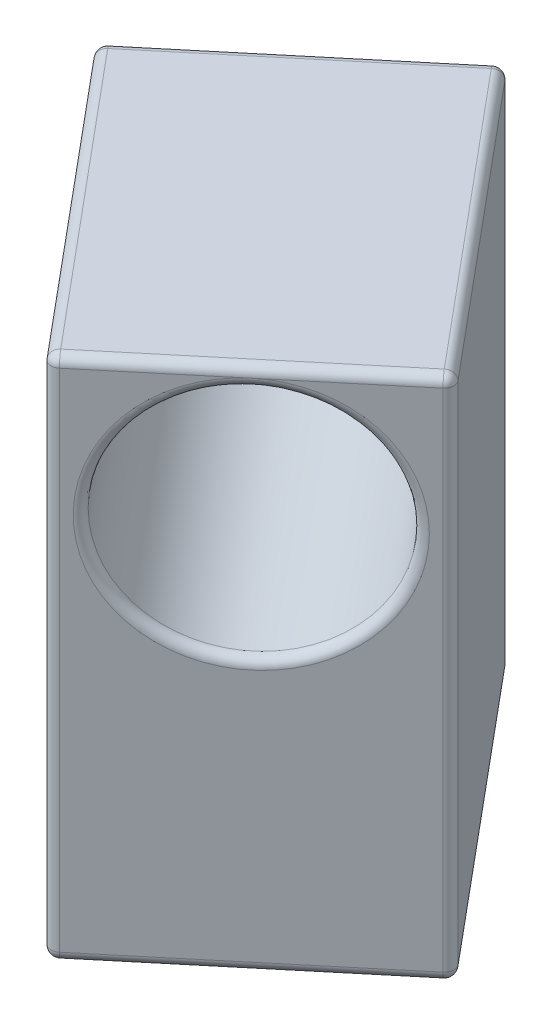
ISO-10303-21;
HEADER;
FILE_DESCRIPTION(('STEP AP214'),'2;1');
FILE_NAME('part.step','',(''),(''),'','','');
FILE_SCHEMA(('AUTOMOTIVE_DESIGN { 1 0 10303 214 1 1 1 1 }'));
ENDSEC;
DATA;
#1=APPLICATION_CONTEXT('core data for automotive mechanical design processes');
#2=APPLICATION_PROTOCOL_DEFINITION('international standard','automotive_design',2000,#1);
#3=PRODUCT_CONTEXT('',#1,'mechanical');
#4=PRODUCT('Part','Part','',(#3));
#5=PRODUCT_RELATED_PRODUCT_CATEGORY('part','',(#4));
#6=PRODUCT_DEFINITION_FORMATION('','',#4);
#7=PRODUCT_DEFINITION_CONTEXT('part definition',#1,'design');
#8=PRODUCT_DEFINITION('design','',#6,#7);
#9=PRODUCT_DEFINITION_SHAPE('','',#8);
#10=(LENGTH_UNIT() NAMED_UNIT(*) SI_UNIT(.MILLI.,.METRE.));
#11=(NAMED_UNIT(*) PLANE_ANGLE_UNIT() SI_UNIT($,.RADIAN.));
#12=(NAMED_UNIT(*) SI_UNIT($,.STERADIAN.) SOLID_ANGLE_UNIT());
#13=UNCERTAINTY_MEASURE_WITH_UNIT(LENGTH_MEASURE(1.E-05),#10,'distance_accuracy_value','');
#14=(GEOMETRIC_REPRESENTATION_CONTEXT(3) GLOBAL_UNCERTAINTY_ASSIGNED_CONTEXT((#13)) GLOBAL_UNIT_ASSIGNED_CONTEXT((#10,
#11,#12)) REPRESENTATION_CONTEXT('',''));
#15=CARTESIAN_POINT('',(0.,0.,0.));
#16=DIRECTION('',(0.,0.,1.));
#17=DIRECTION('',(1.,0.,0.));
#18=AXIS2_PLACEMENT_3D('',#15,#16,#17);
#19=CARTESIAN_POINT('',(199.483711764187,-20.,-235.862123975211));
#20=DIRECTION('',(0.767782639292157,0.,-0.640710401664878));
#21=DIRECTION('',(-0.640710401664878,0.,-0.767782639292157));
#22=AXIS2_PLACEMENT_3D('',#19,#20,#21);
#23=PLANE('',#22);
#24=DIRECTION('',(0.,1.,0.));
#25=VECTOR('',#24,1.);
#26=CARTESIAN_POINT('',(211.977564596652,-20.,-220.890362509014));
#27=LINE('',#26,#25);
#28=CARTESIAN_POINT('',(211.977564596652,6.5,-220.890362509014));
#29=VERTEX_POINT('',#28);
#30=CARTESIAN_POINT('',(211.977564596652,-19.5,-220.890362509014));
#31=VERTEX_POINT('',#30);
#32=EDGE_CURVE('E242',#29,#31,#27,.F.);
#33=ORIENTED_EDGE('',*,*,#32,.T.);
#34=DIRECTION('',(-0.640710401664878,0.,-0.767782639292157));
#35=VECTOR('',#34,1.);
#36=CARTESIAN_POINT('',(199.483711764187,-19.5,-235.862123975211));
#37=LINE('',#36,#35);
#38=CARTESIAN_POINT('',(199.80406696502,-19.5,-235.478232655565));
#39=VERTEX_POINT('',#38);
#40=EDGE_CURVE('E248',#31,#39,#37,.T.);
#41=ORIENTED_EDGE('',*,*,#40,.T.);
#42=DIRECTION('',(0.,1.,0.));
#43=VECTOR('',#42,1.);
#44=CARTESIAN_POINT('',(199.80406696502,-20.,-235.478232655565));
#45=LINE('',#44,#43);
#46=CARTESIAN_POINT('',(199.80406696502,6.5,-235.478232655565));
#47=VERTEX_POINT('',#46);
#48=EDGE_CURVE('E245',#39,#47,#45,.T.);
#49=ORIENTED_EDGE('',*,*,#48,.T.);
#50=DIRECTION('',(-0.640710401664878,0.,-0.767782639292157));
#51=VECTOR('',#50,1.);
#52=CARTESIAN_POINT('',(199.483711764187,6.5,-235.862123975211));
#53=LINE('',#52,#51);
#54=EDGE_CURVE('E239',#47,#29,#53,.F.);
#55=ORIENTED_EDGE('',*,*,#54,.T.);
#56=EDGE_LOOP('',(#33,#41,#49,#55));
#57=FACE_BOUND('',#56,.T.);
#58=ADVANCED_FACE('F48',(#57),#23,.T.);
#59=CARTESIAN_POINT('',(200.781180208103,-20.,-210.895815164395));
#60=DIRECTION('',(0.640710401664878,0.,0.767782639292157));
#61=DIRECTION('',(0.767782639292157,0.,-0.640710401664878));
#62=AXIS2_PLACEMENT_3D('',#59,#60,#61);
#63=PLANE('',#62);
#64=CARTESIAN_POINT('',(206.539550002794,0.,-215.701143176882));
#65=DIRECTION('',(0.640710401664878,0.,0.767782639292157));
#66=DIRECTION('',(0.767782639292157,0.,-0.640710401664878));
#67=AXIS2_PLACEMENT_3D('',#64,#65,#66);
#68=CIRCLE('',#67,6.49999999999998);
#69=CARTESIAN_POINT('',(206.539550002794,6.5,-215.701143176882));
#70=VERTEX_POINT('',#69);
#71=CARTESIAN_POINT('',(211.530137158193,0.,-219.865760787703));
#72=VERTEX_POINT('',#71);
#73=EDGE_CURVE('E267',#70,#72,#68,.F.);
#74=ORIENTED_EDGE('',*,*,#73,.T.);
#75=CARTESIAN_POINT('',(206.539550002794,0.,-215.701143176882));
#76=DIRECTION('',(0.640710401664878,0.,0.767782639292157));
#77=DIRECTION('',(0.767782639292157,0.,-0.640710401664878));
#78=AXIS2_PLACEMENT_3D('',#75,#76,#77);
#79=CIRCLE('',#78,6.49999999999998);
#80=EDGE_CURVE('E270',#72,#70,#79,.F.);
#81=ORIENTED_EDGE('',*,*,#80,.T.);
#82=DIRECTION('',(0.767782639292157,0.,-0.640710401664878));
#83=VECTOR('',#82,1.);
#84=CARTESIAN_POINT('',(200.781180208103,6.5,-210.895815164395));
#85=LINE('',#84,#83);
#86=CARTESIAN_POINT('',(201.165071527749,6.5,-211.216170365227));
#87=VERTEX_POINT('',#86);
#88=EDGE_CURVE('E252',#70,#87,#85,.F.);
#89=ORIENTED_EDGE('',*,*,#88,.T.);
#90=DIRECTION('',(0.,1.,0.));
#91=VECTOR('',#90,1.);
#92=CARTESIAN_POINT('',(201.165071527749,-20.,-211.216170365227));
#93=LINE('',#92,#91);
#94=CARTESIAN_POINT('',(201.165071527749,-19.5,-211.216170365227));
#95=VERTEX_POINT('',#94);
#96=EDGE_CURVE('E259',#87,#95,#93,.F.);
#97=ORIENTED_EDGE('',*,*,#96,.T.);
#98=DIRECTION('',(0.767782639292157,0.,-0.640710401664878));
#99=VECTOR('',#98,1.);
#100=CARTESIAN_POINT('',(212.297919797485,-19.5,-220.506471189368));
#101=LINE('',#100,#99);
#102=CARTESIAN_POINT('',(211.914028477839,-19.5,-220.186115988536));
#103=VERTEX_POINT('',#102);
#104=EDGE_CURVE('E168',#95,#103,#101,.T.);
#105=ORIENTED_EDGE('',*,*,#104,.T.);
#106=DIRECTION('',(0.,1.,0.));
#107=VECTOR('',#106,1.);
#108=CARTESIAN_POINT('',(211.914028477839,-20.,-220.186115988536));
#109=LINE('',#108,#107);
#110=CARTESIAN_POINT('',(211.914028477839,6.5,-220.186115988536));
#111=VERTEX_POINT('',#110);
#112=EDGE_CURVE('E262',#103,#111,#109,.T.);
#113=ORIENTED_EDGE('',*,*,#112,.T.);
#114=DIRECTION('',(0.767782639292157,0.,-0.640710401664878));
#115=VECTOR('',#114,1.);
#116=CARTESIAN_POINT('',(200.781180208103,6.5,-210.895815164395));
#117=LINE('',#116,#115);
#118=EDGE_CURVE('E255',#111,#70,#117,.F.);
#119=ORIENTED_EDGE('',*,*,#118,.T.);
#120=EDGE_LOOP('',(#74,#81,#89,#97,#105,#113,#119));
#121=FACE_BOUND('',#120,.T.);
#122=ADVANCED_FACE('F393',(#121),#63,.T.);
#123=CARTESIAN_POINT('',(187.966972174805,-20.,-226.251467950238));
#124=DIRECTION('',(-0.767782639292157,0.,0.640710401664878));
#125=DIRECTION('',(0.640710401664878,0.,0.767782639292157));
#126=AXIS2_PLACEMENT_3D('',#123,#124,#125);
#127=PLANE('',#126);
#128=DIRECTION('',(0.,1.,0.));
#129=VECTOR('',#128,1.);
#130=CARTESIAN_POINT('',(188.287327375637,-20.,-225.867576630592));
#131=LINE('',#130,#129);
#132=CARTESIAN_POINT('',(188.287327375637,6.5,-225.867576630592));
#133=VERTEX_POINT('',#132);
#134=CARTESIAN_POINT('',(188.287327375637,-19.5,-225.867576630592));
#135=VERTEX_POINT('',#134);
#136=EDGE_CURVE('E280',#133,#135,#131,.F.);
#137=ORIENTED_EDGE('',*,*,#136,.T.);
#138=DIRECTION('',(0.640710401664878,0.,0.767782639292157));
#139=VECTOR('',#138,1.);
#140=CARTESIAN_POINT('',(200.781180208103,-19.5,-210.895815164395));
#141=LINE('',#140,#139);
#142=CARTESIAN_POINT('',(200.46082500727,-19.5,-211.279706484041));
#143=VERTEX_POINT('',#142);
#144=EDGE_CURVE('E283',#135,#143,#141,.T.);
#145=ORIENTED_EDGE('',*,*,#144,.T.);
#146=DIRECTION('',(0.,1.,0.));
#147=VECTOR('',#146,1.);
#148=CARTESIAN_POINT('',(200.46082500727,-20.,-211.279706484041));
#149=LINE('',#148,#147);
#150=CARTESIAN_POINT('',(200.46082500727,6.5,-211.279706484041));
#151=VERTEX_POINT('',#150);
#152=EDGE_CURVE('E277',#143,#151,#149,.T.);
#153=ORIENTED_EDGE('',*,*,#152,.T.);
#154=DIRECTION('',(0.640710401664878,0.,0.767782639292157));
#155=VECTOR('',#154,1.);
#156=CARTESIAN_POINT('',(187.966972174805,6.5,-226.251467950238));
#157=LINE('',#156,#155);
#158=EDGE_CURVE('E274',#151,#133,#157,.F.);
#159=ORIENTED_EDGE('',*,*,#158,.T.);
#160=EDGE_LOOP('',(#137,#145,#153,#159));
#161=FACE_BOUND('',#160,.T.);
#162=ADVANCED_FACE('F399',(#161),#127,.T.);
#163=CARTESIAN_POINT('',(187.966972174805,-20.,-226.251467950238));
#164=DIRECTION('',(-0.640710401664878,0.,-0.767782639292157));
#165=DIRECTION('',(-0.767782639292157,0.,0.640710401664878));
#166=AXIS2_PLACEMENT_3D('',#163,#164,#165);
#167=PLANE('',#166);
#168=CARTESIAN_POINT('',(193.725341969496,0.,-231.056795962725));
#169=DIRECTION('',(-0.640710401664878,0.,-0.767782639292157));
#170=DIRECTION('',(-0.767782639292157,0.,0.640710401664878));
#171=AXIS2_PLACEMENT_3D('',#168,#169,#170);
#172=CIRCLE('',#171,6.49999999999998);
#173=CARTESIAN_POINT('',(193.725341969496,6.5,-231.056795962725));
#174=VERTEX_POINT('',#173);
#175=CARTESIAN_POINT('',(188.734754814097,0.,-226.892178351903));
#176=VERTEX_POINT('',#175);
#177=EDGE_CURVE('E224',#174,#176,#172,.F.);
#178=ORIENTED_EDGE('',*,*,#177,.T.);
#179=CARTESIAN_POINT('',(193.725341969496,0.,-231.056795962725));
#180=DIRECTION('',(-0.640710401664878,0.,-0.767782639292157));
#181=DIRECTION('',(-0.767782639292157,0.,0.640710401664878));
#182=AXIS2_PLACEMENT_3D('',#179,#180,#181);
#183=CIRCLE('',#182,6.49999999999998);
#184=EDGE_CURVE('E227',#176,#174,#183,.F.);
#185=ORIENTED_EDGE('',*,*,#184,.T.);
#186=DIRECTION('',(-0.767782639292157,0.,0.640710401664878));
#187=VECTOR('',#186,1.);
#188=CARTESIAN_POINT('',(187.966972174805,6.5,-226.251467950238));
#189=LINE('',#188,#187);
#190=CARTESIAN_POINT('',(199.099820444541,6.5,-235.541768774379));
#191=VERTEX_POINT('',#190);
#192=EDGE_CURVE('E207',#174,#191,#189,.F.);
#193=ORIENTED_EDGE('',*,*,#192,.T.);
#194=DIRECTION('',(0.,1.,0.));
#195=VECTOR('',#194,1.);
#196=CARTESIAN_POINT('',(199.099820444541,-20.,-235.541768774379));
#197=LINE('',#196,#195);
#198=CARTESIAN_POINT('',(199.099820444541,-19.5,-235.541768774379));
#199=VERTEX_POINT('',#198);
#200=EDGE_CURVE('E217',#191,#199,#197,.F.);
#201=ORIENTED_EDGE('',*,*,#200,.T.);
#202=DIRECTION('',(-0.767782639292157,0.,0.640710401664878));
#203=VECTOR('',#202,1.);
#204=CARTESIAN_POINT('',(187.966972174805,-19.5,-226.251467950238));
#205=LINE('',#204,#203);
#206=CARTESIAN_POINT('',(188.350863494451,-19.5,-226.571823151071));
#207=VERTEX_POINT('',#206);
#208=EDGE_CURVE('E220',#199,#207,#205,.T.);
#209=ORIENTED_EDGE('',*,*,#208,.T.);
#210=DIRECTION('',(0.,1.,0.));
#211=VECTOR('',#210,1.);
#212=CARTESIAN_POINT('',(188.350863494451,-20.,-226.571823151071));
#213=LINE('',#212,#211);
#214=CARTESIAN_POINT('',(188.350863494451,6.5,-226.571823151071));
#215=VERTEX_POINT('',#214);
#216=EDGE_CURVE('E214',#207,#215,#213,.T.);
#217=ORIENTED_EDGE('',*,*,#216,.T.);
#218=DIRECTION('',(-0.767782639292157,0.,0.640710401664878));
#219=VECTOR('',#218,1.);
#220=CARTESIAN_POINT('',(187.966972174805,6.5,-226.251467950238));
#221=LINE('',#220,#219);
#222=EDGE_CURVE('E210',#215,#174,#221,.F.);
#223=ORIENTED_EDGE('',*,*,#222,.T.);
#224=EDGE_LOOP('',(#178,#185,#193,#201,#209,#217,#223));
#225=FACE_BOUND('',#224,.T.);
#226=ADVANCED_FACE('F404',(#225),#167,.T.);
#227=CARTESIAN_POINT('',(0.,-20.,0.));
#228=DIRECTION('',(0.,1.,0.));
#229=DIRECTION('',(0.,0.,1.));
#230=AXIS2_PLACEMENT_3D('',#227,#228,#229);
#231=PLANE('',#230);
#232=CARTESIAN_POINT('',(200.132445986145,-20.,-223.378969569803));
#233=DIRECTION('',(0.,1.,0.));
#234=DIRECTION('',(0.,0.,1.));
#235=AXIS2_PLACEMENT_3D('',#232,#233,#234);
#236=CIRCLE('',#235,6.50000000000002);
#237=CARTESIAN_POINT('',(200.132445986145,-20.,-216.878969569803));
#238=VERTEX_POINT('',#237);
#239=EDGE_CURVE('E203',#238,#238,#236,.T.);
#240=ORIENTED_EDGE('',*,*,#239,.T.);
#241=EDGE_LOOP('',(#240));
#242=FACE_BOUND('',#241,.T.);
#243=DIRECTION('',(0.640710401664878,0.,0.767782639292157));
#244=VECTOR('',#243,1.);
#245=CARTESIAN_POINT('',(188.350863494451,-20.,-226.571823151071));
#246=LINE('',#245,#244);
#247=CARTESIAN_POINT('',(200.844716326916,-20.,-211.600061684873));
#248=VERTEX_POINT('',#247);
#249=CARTESIAN_POINT('',(188.671218695283,-20.,-226.187931831424));
#250=VERTEX_POINT('',#249);
#251=EDGE_CURVE('E153',#248,#250,#246,.F.);
#252=ORIENTED_EDGE('',*,*,#251,.T.);
#253=DIRECTION('',(-0.767782639292157,0.,0.640710401664878));
#254=VECTOR('',#253,1.);
#255=CARTESIAN_POINT('',(199.80406696502,-20.,-235.478232655565));
#256=LINE('',#255,#254);
#257=CARTESIAN_POINT('',(199.420175645374,-20.,-235.157877454733));
#258=VERTEX_POINT('',#257);
#259=EDGE_CURVE('E200',#250,#258,#256,.F.);
#260=ORIENTED_EDGE('',*,*,#259,.T.);
#261=DIRECTION('',(-0.640710401664878,0.,-0.767782639292157));
#262=VECTOR('',#261,1.);
#263=CARTESIAN_POINT('',(211.914028477839,-20.,-220.186115988536));
#264=LINE('',#263,#262);
#265=CARTESIAN_POINT('',(211.593673277006,-20.,-220.570007308182));
#266=VERTEX_POINT('',#265);
#267=EDGE_CURVE('E156',#258,#266,#264,.F.);
#268=ORIENTED_EDGE('',*,*,#267,.T.);
#269=DIRECTION('',(0.767782639292157,0.,-0.640710401664878));
#270=VECTOR('',#269,1.);
#271=CARTESIAN_POINT('',(200.46082500727,-20.,-211.279706484041));
#272=LINE('',#271,#270);
#273=EDGE_CURVE('E148',#266,#248,#272,.F.);
#274=ORIENTED_EDGE('',*,*,#273,.T.);
#275=EDGE_LOOP('',(#252,#260,#268,#274));
#276=FACE_BOUND('',#275,.T.);
#277=ADVANCED_FACE('F150',(#242,#276),#231,.F.);
#278=CARTESIAN_POINT('',(0.,7.,0.));
#279=DIRECTION('',(0.,1.,0.));
#280=DIRECTION('',(0.,0.,1.));
#281=AXIS2_PLACEMENT_3D('',#278,#279,#280);
#282=PLANE('',#281);
#283=DIRECTION('',(0.640710401664878,0.,0.767782639292157));
#284=VECTOR('',#283,1.);
#285=CARTESIAN_POINT('',(222.487628556415,7.,-185.664705819955));
#286=LINE('',#285,#284);
#287=CARTESIAN_POINT('',(188.671218695283,7.,-226.187931831424));
#288=VERTEX_POINT('',#287);
#289=CARTESIAN_POINT('',(200.844716326916,7.,-211.600061684873));
#290=VERTEX_POINT('',#289);
#291=EDGE_CURVE('E58',#288,#290,#286,.T.);
#292=ORIENTED_EDGE('',*,*,#291,.T.);
#293=DIRECTION('',(0.767782639292157,0.,-0.640710401664878));
#294=VECTOR('',#293,1.);
#295=CARTESIAN_POINT('',(-21.6429122294992,7.,-25.9353558649184));
#296=LINE('',#295,#294);
#297=CARTESIAN_POINT('',(211.593673277006,7.,-220.570007308182));
#298=VERTEX_POINT('',#297);
#299=EDGE_CURVE('E12',#290,#298,#296,.T.);
#300=ORIENTED_EDGE('',*,*,#299,.T.);
#301=DIRECTION('',(-0.640710401664878,0.,-0.767782639292157));
#302=VECTOR('',#301,1.);
#303=CARTESIAN_POINT('',(233.236585506506,7.,-194.634651443263));
#304=LINE('',#303,#302);
#305=CARTESIAN_POINT('',(199.420175645374,7.,-235.157877454733));
#306=VERTEX_POINT('',#305);
#307=EDGE_CURVE('E287',#298,#306,#304,.T.);
#308=ORIENTED_EDGE('',*,*,#307,.T.);
#309=DIRECTION('',(-0.767782639292157,0.,0.640710401664878));
#310=VECTOR('',#309,1.);
#311=CARTESIAN_POINT('',(-33.8164098611319,7.,-40.5232260114694));
#312=LINE('',#311,#310);
#313=EDGE_CURVE('E69',#306,#288,#312,.T.);
#314=ORIENTED_EDGE('',*,*,#313,.T.);
#315=EDGE_LOOP('',(#292,#300,#308,#314));
#316=FACE_BOUND('',#315,.T.);
#317=ADVANCED_FACE('F382',(#316),#282,.T.);
#318=CARTESIAN_POINT('',(200.132445986145,-10.,-223.378969569803));
#319=DIRECTION('',(0.,-1.,0.));
#320=DIRECTION('',(0.,0.,-1.));
#321=AXIS2_PLACEMENT_3D('',#318,#319,#320);
#322=CYLINDRICAL_SURFACE('',#321,6.00000000000002);
#323=CARTESIAN_POINT('',(200.132445986145,-19.5,-223.378969569803));
#324=DIRECTION('',(0.,1.,0.));
#325=DIRECTION('',(0.,0.,1.));
#326=AXIS2_PLACEMENT_3D('',#323,#324,#325);
#327=CIRCLE('',#326,6.00000000000002);
#328=CARTESIAN_POINT('',(200.132445986145,-19.5,-217.378969569803));
#329=VERTEX_POINT('',#328);
#330=EDGE_CURVE('E190',#329,#329,#327,.F.);
#331=ORIENTED_EDGE('',*,*,#330,.T.);
#332=EDGE_LOOP('',(#331));
#333=FACE_BOUND('',#332,.T.);
#334=CARTESIAN_POINT('',(200.132445986145,-10.,-223.378969569803));
#335=DIRECTION('',(0.,-1.,0.));
#336=DIRECTION('',(0.,0.,-1.));
#337=AXIS2_PLACEMENT_3D('',#334,#335,#336);
#338=CIRCLE('',#337,6.00000000000002);
#339=CARTESIAN_POINT('',(200.132445986145,-10.,-229.378969569803));
#340=VERTEX_POINT('',#339);
#341=EDGE_CURVE('E194',#340,#340,#338,.T.);
#342=ORIENTED_EDGE('',*,*,#341,.F.);
#343=EDGE_LOOP('',(#342));
#344=FACE_BOUND('',#343,.T.);
#345=ADVANCED_FACE('F380',(#333,#344),#322,.F.);
#346=CARTESIAN_POINT('',(200.132445986145,-10.,-223.378969569803));
#347=DIRECTION('',(0.,-1.,0.));
#348=DIRECTION('',(0.,0.,-1.));
#349=AXIS2_PLACEMENT_3D('',#346,#347,#348);
#350=PLANE('',#349);
#351=ORIENTED_EDGE('',*,*,#341,.T.);
#352=EDGE_LOOP('',(#351));
#353=FACE_BOUND('',#352,.T.);
#354=ADVANCED_FACE('F378',(#353),#350,.T.);
#355=CARTESIAN_POINT('',(128.459886797962,0.,-309.266363492759));
#356=DIRECTION('',(0.640710401664878,0.,0.767782639292157));
#357=DIRECTION('',(0.767782639292157,0.,-0.640710401664878));
#358=AXIS2_PLACEMENT_3D('',#355,#356,#357);
#359=CYLINDRICAL_SURFACE('',#358,5.99999999999998);
#360=CARTESIAN_POINT('',(194.045697170329,0.,-230.672904643079));
#361=DIRECTION('',(-0.640710401664878,0.,-0.767782639292157));
#362=DIRECTION('',(-0.767782639292157,0.,0.640710401664878));
#363=AXIS2_PLACEMENT_3D('',#360,#361,#362);
#364=CIRCLE('',#363,5.99999999999998);
#365=CARTESIAN_POINT('',(189.439001334576,0.,-226.828642233089));
#366=VERTEX_POINT('',#365);
#367=EDGE_CURVE('E235',#366,#366,#364,.T.);
#368=ORIENTED_EDGE('',*,*,#367,.T.);
#369=EDGE_LOOP('',(#368));
#370=FACE_BOUND('',#369,.T.);
#371=CARTESIAN_POINT('',(206.219194801961,0.,-216.085034496528));
#372=DIRECTION('',(0.640710401664878,0.,0.767782639292157));
#373=DIRECTION('',(0.767782639292157,0.,-0.640710401664878));
#374=AXIS2_PLACEMENT_3D('',#371,#372,#373);
#375=CIRCLE('',#374,5.99999999999998);
#376=CARTESIAN_POINT('',(210.825890637714,0.,-219.929296906517));
#377=VERTEX_POINT('',#376);
#378=EDGE_CURVE('E231',#377,#377,#375,.T.);
#379=ORIENTED_EDGE('',*,*,#378,.T.);
#380=EDGE_LOOP('',(#379));
#381=FACE_BOUND('',#380,.T.);
#382=ADVANCED_FACE('F389',(#370,#381),#359,.F.);
#383=CARTESIAN_POINT('',(200.132445986145,-19.5,-223.378969569803));
#384=DIRECTION('',(0.,1.,0.));
#385=DIRECTION('',(0.,0.,1.));
#386=AXIS2_PLACEMENT_3D('',#383,#384,#385);
#387=TOROIDAL_SURFACE('',#386,6.50000000000002,0.5);
#388=ORIENTED_EDGE('',*,*,#239,.F.);
#389=EDGE_LOOP('',(#388));
#390=FACE_BOUND('',#389,.T.);
#391=ORIENTED_EDGE('',*,*,#330,.F.);
#392=EDGE_LOOP('',(#391));
#393=FACE_BOUND('',#392,.T.);
#394=ADVANCED_FACE('F406',(#390,#393),#387,.T.);
#395=CARTESIAN_POINT('',(-21.6429122294992,6.5,-25.9353558649184));
#396=DIRECTION('',(0.767782639292157,0.,-0.640710401664878));
#397=DIRECTION('',(-0.640710401664878,0.,-0.767782639292157));
#398=AXIS2_PLACEMENT_3D('',#395,#396,#397);
#399=CYLINDRICAL_SURFACE('',#398,0.5);
#400=CARTESIAN_POINT('',(211.593673277006,6.5,-220.570007308182));
#401=DIRECTION('',(0.767782639292145,0.,-0.640710401664892));
#402=DIRECTION('',(-0.640710401664892,0.,-0.767782639292146));
#403=AXIS2_PLACEMENT_3D('',#400,#401,#402);
#404=CIRCLE('',#403,0.5);
#405=EDGE_CURVE('E52',#298,#111,#404,.T.);
#406=ORIENTED_EDGE('',*,*,#405,.F.);
#407=ORIENTED_EDGE('',*,*,#299,.F.);
#408=CARTESIAN_POINT('',(200.844716326916,6.5,-211.600061684873));
#409=DIRECTION('',(-0.767782639292172,0.,0.640710401664859));
#410=DIRECTION('',(0.640710401664859,0.,0.767782639292173));
#411=AXIS2_PLACEMENT_3D('',#408,#409,#410);
#412=CIRCLE('',#411,0.5);
#413=EDGE_CURVE('E361',#87,#290,#412,.T.);
#414=ORIENTED_EDGE('',*,*,#413,.F.);
#415=ORIENTED_EDGE('',*,*,#88,.F.);
#416=ORIENTED_EDGE('',*,*,#118,.F.);
#417=EDGE_LOOP('',(#406,#407,#414,#415,#416));
#418=FACE_BOUND('',#417,.T.);
#419=ADVANCED_FACE('F409',(#418),#399,.T.);
#420=CARTESIAN_POINT('',(211.593673277006,6.5,-220.570007308182));
#421=DIRECTION('',(0.640710401664887,0.,0.76778263929215));
#422=DIRECTION('',(0.76778263929215,0.,-0.640710401664887));
#423=AXIS2_PLACEMENT_3D('',#420,#421,#422);
#424=SPHERICAL_SURFACE('',#423,0.5);
#425=CARTESIAN_POINT('',(211.593673277006,6.5,-220.570007308182));
#426=DIRECTION('',(0.640710401664859,0.,0.767782639292172));
#427=DIRECTION('',(0.767782639292173,0.,-0.640710401664859));
#428=AXIS2_PLACEMENT_3D('',#425,#426,#427);
#429=CIRCLE('',#428,0.5);
#430=EDGE_CURVE('E354',#298,#29,#429,.F.);
#431=ORIENTED_EDGE('',*,*,#430,.F.);
#432=ORIENTED_EDGE('',*,*,#405,.T.);
#433=CARTESIAN_POINT('',(211.593673277006,6.5,-220.570007308182));
#434=DIRECTION('',(0.,1.,0.));
#435=DIRECTION('',(0.,0.,1.));
#436=AXIS2_PLACEMENT_3D('',#433,#434,#435);
#437=CIRCLE('',#436,0.5);
#438=EDGE_CURVE('E358',#29,#111,#437,.F.);
#439=ORIENTED_EDGE('',*,*,#438,.F.);
#440=EDGE_LOOP('',(#431,#432,#439));
#441=FACE_BOUND('',#440,.T.);
#442=ADVANCED_FACE('F477',(#441),#424,.T.);
#443=CARTESIAN_POINT('',(200.844716326916,6.5,-211.600061684873));
#444=DIRECTION('',(0.,1.,0.));
#445=DIRECTION('',(0.,0.,1.));
#446=AXIS2_PLACEMENT_3D('',#443,#444,#445);
#447=SPHERICAL_SURFACE('',#446,0.5);
#448=CARTESIAN_POINT('',(200.844716326916,6.5,-211.600061684873));
#449=DIRECTION('',(0.,1.,0.));
#450=DIRECTION('',(0.,0.,1.));
#451=AXIS2_PLACEMENT_3D('',#448,#449,#450);
#452=CIRCLE('',#451,0.5);
#453=EDGE_CURVE('E346',#87,#151,#452,.F.);
#454=ORIENTED_EDGE('',*,*,#453,.F.);
#455=ORIENTED_EDGE('',*,*,#413,.T.);
#456=CARTESIAN_POINT('',(200.844716326916,6.5,-211.600061684873));
#457=DIRECTION('',(0.64071040166492,0.,0.767782639292122));
#458=DIRECTION('',(0.767782639292123,0.,-0.64071040166492));
#459=AXIS2_PLACEMENT_3D('',#456,#457,#458);
#460=CIRCLE('',#459,0.5);
#461=EDGE_CURVE('E350',#151,#290,#460,.F.);
#462=ORIENTED_EDGE('',*,*,#461,.F.);
#463=EDGE_LOOP('',(#454,#455,#462));
#464=FACE_BOUND('',#463,.T.);
#465=ADVANCED_FACE('F473',(#464),#447,.T.);
#466=CARTESIAN_POINT('',(211.593673277006,-20.,-220.570007308182));
#467=DIRECTION('',(0.,1.,0.));
#468=DIRECTION('',(0.,0.,1.));
#469=AXIS2_PLACEMENT_3D('',#466,#467,#468);
#470=CYLINDRICAL_SURFACE('',#469,0.5);
#471=ORIENTED_EDGE('',*,*,#438,.T.);
#472=ORIENTED_EDGE('',*,*,#112,.F.);
#473=CARTESIAN_POINT('',(211.593673277006,-19.5,-220.570007308182));
#474=DIRECTION('',(0.,-1.,0.));
#475=DIRECTION('',(0.,0.,-1.));
#476=AXIS2_PLACEMENT_3D('',#473,#474,#475);
#477=CIRCLE('',#476,0.5);
#478=EDGE_CURVE('E340',#31,#103,#477,.T.);
#479=ORIENTED_EDGE('',*,*,#478,.F.);
#480=ORIENTED_EDGE('',*,*,#32,.F.);
#481=EDGE_LOOP('',(#471,#472,#479,#480));
#482=FACE_BOUND('',#481,.T.);
#483=ADVANCED_FACE('F469',(#482),#470,.T.);
#484=CARTESIAN_POINT('',(233.236585506506,6.5,-194.634651443263));
#485=DIRECTION('',(-0.640710401664878,0.,-0.767782639292157));
#486=DIRECTION('',(-0.767782639292157,0.,0.640710401664878));
#487=AXIS2_PLACEMENT_3D('',#484,#485,#486);
#488=CYLINDRICAL_SURFACE('',#487,0.5);
#489=ORIENTED_EDGE('',*,*,#430,.T.);
#490=ORIENTED_EDGE('',*,*,#54,.F.);
#491=CARTESIAN_POINT('',(199.420175645374,6.5,-235.157877454733));
#492=DIRECTION('',(-0.640710401664887,0.,-0.76778263929215));
#493=DIRECTION('',(-0.76778263929215,0.,0.640710401664887));
#494=AXIS2_PLACEMENT_3D('',#491,#492,#493);
#495=CIRCLE('',#494,0.5);
#496=EDGE_CURVE('E336',#306,#47,#495,.T.);
#497=ORIENTED_EDGE('',*,*,#496,.F.);
#498=ORIENTED_EDGE('',*,*,#307,.F.);
#499=EDGE_LOOP('',(#489,#490,#497,#498));
#500=FACE_BOUND('',#499,.T.);
#501=ADVANCED_FACE('F465',(#500),#488,.T.);
#502=CARTESIAN_POINT('',(-33.8164098611319,6.5,-40.5232260114694));
#503=DIRECTION('',(-0.767782639292157,0.,0.640710401664878));
#504=DIRECTION('',(0.640710401664878,0.,0.767782639292157));
#505=AXIS2_PLACEMENT_3D('',#502,#503,#504);
#506=CYLINDRICAL_SURFACE('',#505,0.5);
#507=CARTESIAN_POINT('',(188.671218695283,6.5,-226.187931831424));
#508=DIRECTION('',(-0.767782639292122,0.,0.64071040166492));
#509=DIRECTION('',(0.64071040166492,0.,0.767782639292123));
#510=AXIS2_PLACEMENT_3D('',#507,#508,#509);
#511=CIRCLE('',#510,0.5);
#512=EDGE_CURVE('E328',#288,#215,#511,.T.);
#513=ORIENTED_EDGE('',*,*,#512,.F.);
#514=ORIENTED_EDGE('',*,*,#313,.F.);
#515=CARTESIAN_POINT('',(199.420175645374,6.5,-235.157877454733));
#516=DIRECTION('',(0.767782639292172,0.,-0.640710401664859));
#517=DIRECTION('',(-0.640710401664859,0.,-0.767782639292173));
#518=AXIS2_PLACEMENT_3D('',#515,#516,#517);
#519=CIRCLE('',#518,0.5);
#520=EDGE_CURVE('E332',#191,#306,#519,.T.);
#521=ORIENTED_EDGE('',*,*,#520,.F.);
#522=ORIENTED_EDGE('',*,*,#192,.F.);
#523=ORIENTED_EDGE('',*,*,#222,.F.);
#524=EDGE_LOOP('',(#513,#514,#521,#522,#523));
#525=FACE_BOUND('',#524,.T.);
#526=ADVANCED_FACE('F461',(#525),#506,.T.);
#527=CARTESIAN_POINT('',(222.487628556415,6.5,-185.664705819955));
#528=DIRECTION('',(0.640710401664878,0.,0.767782639292157));
#529=DIRECTION('',(0.767782639292157,0.,-0.640710401664878));
#530=AXIS2_PLACEMENT_3D('',#527,#528,#529);
#531=CYLINDRICAL_SURFACE('',#530,0.5);
#532=ORIENTED_EDGE('',*,*,#461,.T.);
#533=ORIENTED_EDGE('',*,*,#291,.F.);
#534=CARTESIAN_POINT('',(188.671218695283,6.5,-226.187931831424));
#535=DIRECTION('',(-0.640710401664859,0.,-0.767782639292172));
#536=DIRECTION('',(-0.767782639292173,0.,0.640710401664859));
#537=AXIS2_PLACEMENT_3D('',#534,#535,#536);
#538=CIRCLE('',#537,0.5);
#539=EDGE_CURVE('E324',#133,#288,#538,.T.);
#540=ORIENTED_EDGE('',*,*,#539,.F.);
#541=ORIENTED_EDGE('',*,*,#158,.F.);
#542=EDGE_LOOP('',(#532,#533,#540,#541));
#543=FACE_BOUND('',#542,.T.);
#544=ADVANCED_FACE('F457',(#543),#531,.T.);
#545=CARTESIAN_POINT('',(200.844716326916,-20.,-211.600061684873));
#546=DIRECTION('',(0.,1.,0.));
#547=DIRECTION('',(0.,0.,1.));
#548=AXIS2_PLACEMENT_3D('',#545,#546,#547);
#549=CYLINDRICAL_SURFACE('',#548,0.5);
#550=ORIENTED_EDGE('',*,*,#453,.T.);
#551=ORIENTED_EDGE('',*,*,#152,.F.);
#552=CARTESIAN_POINT('',(200.844716326916,-19.5,-211.600061684873));
#553=DIRECTION('',(0.,-1.,0.));
#554=DIRECTION('',(0.,0.,-1.));
#555=AXIS2_PLACEMENT_3D('',#552,#553,#554);
#556=CIRCLE('',#555,0.5);
#557=EDGE_CURVE('E173',#95,#143,#556,.T.);
#558=ORIENTED_EDGE('',*,*,#557,.F.);
#559=ORIENTED_EDGE('',*,*,#96,.F.);
#560=EDGE_LOOP('',(#550,#551,#558,#559));
#561=FACE_BOUND('',#560,.T.);
#562=ADVANCED_FACE('F454',(#561),#549,.T.);
#563=CARTESIAN_POINT('',(200.46082500727,-19.5,-211.279706484041));
#564=DIRECTION('',(-0.767782639292157,0.,0.640710401664878));
#565=DIRECTION('',(0.640710401664878,0.,0.767782639292157));
#566=AXIS2_PLACEMENT_3D('',#563,#564,#565);
#567=CYLINDRICAL_SURFACE('',#566,0.5);
#568=CARTESIAN_POINT('',(211.593673277006,-19.5,-220.570007308182));
#569=DIRECTION('',(0.767782639292172,0.,-0.640710401664859));
#570=DIRECTION('',(-0.64071040166486,0.,-0.767782639292173));
#571=AXIS2_PLACEMENT_3D('',#568,#569,#570);
#572=CIRCLE('',#571,0.5);
#573=EDGE_CURVE('E343',#103,#266,#572,.T.);
#574=ORIENTED_EDGE('',*,*,#573,.F.);
#575=ORIENTED_EDGE('',*,*,#104,.F.);
#576=CARTESIAN_POINT('',(200.844716326916,-19.5,-211.600061684873));
#577=DIRECTION('',(-0.767782639292172,0.,0.640710401664859));
#578=DIRECTION('',(0.64071040166486,0.,0.767782639292173));
#579=AXIS2_PLACEMENT_3D('',#576,#577,#578);
#580=CIRCLE('',#579,0.5);
#581=EDGE_CURVE('E164',#248,#95,#580,.T.);
#582=ORIENTED_EDGE('',*,*,#581,.F.);
#583=ORIENTED_EDGE('',*,*,#273,.F.);
#584=EDGE_LOOP('',(#574,#575,#582,#583));
#585=FACE_BOUND('',#584,.T.);
#586=ADVANCED_FACE('F166',(#585),#567,.T.);
#587=CARTESIAN_POINT('',(211.593673277006,-19.5,-220.570007308182));
#588=DIRECTION('',(0.640710401664887,0.,0.76778263929215));
#589=DIRECTION('',(0.76778263929215,0.,-0.640710401664887));
#590=AXIS2_PLACEMENT_3D('',#587,#588,#589);
#591=SPHERICAL_SURFACE('',#590,0.5);
#592=ORIENTED_EDGE('',*,*,#478,.T.);
#593=ORIENTED_EDGE('',*,*,#573,.T.);
#594=CARTESIAN_POINT('',(211.593673277006,-19.5,-220.570007308182));
#595=DIRECTION('',(0.640710401664832,0.,0.767782639292195));
#596=DIRECTION('',(0.767782639292195,0.,-0.640710401664832));
#597=AXIS2_PLACEMENT_3D('',#594,#595,#596);
#598=CIRCLE('',#597,0.5);
#599=EDGE_CURVE('E174',#31,#266,#598,.F.);
#600=ORIENTED_EDGE('',*,*,#599,.F.);
#601=EDGE_LOOP('',(#592,#593,#600));
#602=FACE_BOUND('',#601,.T.);
#603=ADVANCED_FACE('F447',(#602),#591,.T.);
#604=CARTESIAN_POINT('',(199.420175645374,6.5,-235.157877454733));
#605=DIRECTION('',(0.,1.,0.));
#606=DIRECTION('',(0.,0.,1.));
#607=AXIS2_PLACEMENT_3D('',#604,#605,#606);
#608=SPHERICAL_SURFACE('',#607,0.5);
#609=ORIENTED_EDGE('',*,*,#520,.T.);
#610=ORIENTED_EDGE('',*,*,#496,.T.);
#611=CARTESIAN_POINT('',(199.420175645374,6.5,-235.157877454733));
#612=DIRECTION('',(0.,1.,0.));
#613=DIRECTION('',(0.,0.,1.));
#614=AXIS2_PLACEMENT_3D('',#611,#612,#613);
#615=CIRCLE('',#614,0.5);
#616=EDGE_CURVE('E315',#191,#47,#615,.F.);
#617=ORIENTED_EDGE('',*,*,#616,.F.);
#618=EDGE_LOOP('',(#609,#610,#617));
#619=FACE_BOUND('',#618,.T.);
#620=ADVANCED_FACE('F443',(#619),#608,.T.);
#621=CARTESIAN_POINT('',(188.671218695283,6.5,-226.187931831424));
#622=DIRECTION('',(0.,1.,0.));
#623=DIRECTION('',(-1.,0.,0.));
#624=AXIS2_PLACEMENT_3D('',#621,#622,#623);
#625=SPHERICAL_SURFACE('',#624,0.5);
#626=ORIENTED_EDGE('',*,*,#539,.T.);
#627=ORIENTED_EDGE('',*,*,#512,.T.);
#628=CARTESIAN_POINT('',(188.671218695283,6.5,-226.187931831424));
#629=DIRECTION('',(0.,1.,0.));
#630=DIRECTION('',(0.,0.,1.));
#631=AXIS2_PLACEMENT_3D('',#628,#629,#630);
#632=CIRCLE('',#631,0.5);
#633=EDGE_CURVE('E182',#133,#215,#632,.F.);
#634=ORIENTED_EDGE('',*,*,#633,.F.);
#635=EDGE_LOOP('',(#626,#627,#634));
#636=FACE_BOUND('',#635,.T.);
#637=ADVANCED_FACE('F440',(#636),#625,.T.);
#638=CARTESIAN_POINT('',(200.844716326916,-19.5,-211.600061684873));
#639=DIRECTION('',(0.640710401664859,0.,0.767782639292173));
#640=DIRECTION('',(0.767782639292173,0.,-0.640710401664859));
#641=AXIS2_PLACEMENT_3D('',#638,#639,#640);
#642=SPHERICAL_SURFACE('',#641,0.5);
#643=ORIENTED_EDGE('',*,*,#581,.T.);
#644=ORIENTED_EDGE('',*,*,#557,.T.);
#645=CARTESIAN_POINT('',(200.844716326916,-19.5,-211.600061684873));
#646=DIRECTION('',(0.640710401664859,0.,0.767782639292172));
#647=DIRECTION('',(0.767782639292173,0.,-0.64071040166486));
#648=AXIS2_PLACEMENT_3D('',#645,#646,#647);
#649=CIRCLE('',#648,0.5);
#650=EDGE_CURVE('E176',#248,#143,#649,.F.);
#651=ORIENTED_EDGE('',*,*,#650,.F.);
#652=EDGE_LOOP('',(#643,#644,#651));
#653=FACE_BOUND('',#652,.T.);
#654=ADVANCED_FACE('F177',(#653),#642,.T.);
#655=CARTESIAN_POINT('',(199.099820444541,-19.5,-235.541768774379));
#656=DIRECTION('',(0.640710401664878,0.,0.767782639292157));
#657=DIRECTION('',(0.767782639292157,0.,-0.640710401664878));
#658=AXIS2_PLACEMENT_3D('',#655,#656,#657);
#659=CYLINDRICAL_SURFACE('',#658,0.5);
#660=ORIENTED_EDGE('',*,*,#599,.T.);
#661=ORIENTED_EDGE('',*,*,#267,.F.);
#662=CARTESIAN_POINT('',(199.420175645374,-19.5,-235.157877454733));
#663=DIRECTION('',(-0.640710401664859,0.,-0.767782639292172));
#664=DIRECTION('',(-0.767782639292173,0.,0.64071040166486));
#665=AXIS2_PLACEMENT_3D('',#662,#663,#664);
#666=CIRCLE('',#665,0.5);
#667=EDGE_CURVE('E183',#39,#258,#666,.T.);
#668=ORIENTED_EDGE('',*,*,#667,.F.);
#669=ORIENTED_EDGE('',*,*,#40,.F.);
#670=EDGE_LOOP('',(#660,#661,#668,#669));
#671=FACE_BOUND('',#670,.T.);
#672=ADVANCED_FACE('F433',(#671),#659,.T.);
#673=CARTESIAN_POINT('',(199.420175645374,-20.,-235.157877454733));
#674=DIRECTION('',(0.,1.,0.));
#675=DIRECTION('',(0.,0.,1.));
#676=AXIS2_PLACEMENT_3D('',#673,#674,#675);
#677=CYLINDRICAL_SURFACE('',#676,0.5);
#678=ORIENTED_EDGE('',*,*,#616,.T.);
#679=ORIENTED_EDGE('',*,*,#48,.F.);
#680=CARTESIAN_POINT('',(199.420175645374,-19.5,-235.157877454733));
#681=DIRECTION('',(0.,-1.,0.));
#682=DIRECTION('',(0.,0.,-1.));
#683=AXIS2_PLACEMENT_3D('',#680,#681,#682);
#684=CIRCLE('',#683,0.5);
#685=EDGE_CURVE('E306',#199,#39,#684,.T.);
#686=ORIENTED_EDGE('',*,*,#685,.F.);
#687=ORIENTED_EDGE('',*,*,#200,.F.);
#688=EDGE_LOOP('',(#678,#679,#686,#687));
#689=FACE_BOUND('',#688,.T.);
#690=ADVANCED_FACE('F429',(#689),#677,.T.);
#691=CARTESIAN_POINT('',(188.671218695283,-20.,-226.187931831424));
#692=DIRECTION('',(0.,1.,0.));
#693=DIRECTION('',(0.,0.,1.));
#694=AXIS2_PLACEMENT_3D('',#691,#692,#693);
#695=CYLINDRICAL_SURFACE('',#694,0.5);
#696=ORIENTED_EDGE('',*,*,#633,.T.);
#697=ORIENTED_EDGE('',*,*,#216,.F.);
#698=CARTESIAN_POINT('',(188.671218695283,-19.5,-226.187931831424));
#699=DIRECTION('',(0.,-1.,0.));
#700=DIRECTION('',(0.,0.,-1.));
#701=AXIS2_PLACEMENT_3D('',#698,#699,#700);
#702=CIRCLE('',#701,0.5);
#703=EDGE_CURVE('E302',#135,#207,#702,.T.);
#704=ORIENTED_EDGE('',*,*,#703,.F.);
#705=ORIENTED_EDGE('',*,*,#136,.F.);
#706=EDGE_LOOP('',(#696,#697,#704,#705));
#707=FACE_BOUND('',#706,.T.);
#708=ADVANCED_FACE('F426',(#707),#695,.T.);
#709=CARTESIAN_POINT('',(188.350863494451,-19.5,-226.571823151071));
#710=DIRECTION('',(-0.640710401664878,0.,-0.767782639292157));
#711=DIRECTION('',(-0.767782639292157,0.,0.640710401664878));
#712=AXIS2_PLACEMENT_3D('',#709,#710,#711);
#713=CYLINDRICAL_SURFACE('',#712,0.5);
#714=ORIENTED_EDGE('',*,*,#650,.T.);
#715=ORIENTED_EDGE('',*,*,#144,.F.);
#716=CARTESIAN_POINT('',(188.671218695283,-19.5,-226.187931831424));
#717=DIRECTION('',(-0.640710401664859,0.,-0.767782639292172));
#718=DIRECTION('',(-0.767782639292173,0.,0.64071040166486));
#719=AXIS2_PLACEMENT_3D('',#716,#717,#718);
#720=CIRCLE('',#719,0.5);
#721=EDGE_CURVE('E187',#250,#135,#720,.T.);
#722=ORIENTED_EDGE('',*,*,#721,.F.);
#723=ORIENTED_EDGE('',*,*,#251,.F.);
#724=EDGE_LOOP('',(#714,#715,#722,#723));
#725=FACE_BOUND('',#724,.T.);
#726=ADVANCED_FACE('F185',(#725),#713,.T.);
#727=CARTESIAN_POINT('',(199.420175645374,-19.5,-235.157877454733));
#728=DIRECTION('',(0.76778263929215,0.,-0.640710401664887));
#729=DIRECTION('',(-0.640710401664887,0.,-0.76778263929215));
#730=AXIS2_PLACEMENT_3D('',#727,#728,#729);
#731=SPHERICAL_SURFACE('',#730,0.5);
#732=ORIENTED_EDGE('',*,*,#685,.T.);
#733=ORIENTED_EDGE('',*,*,#667,.T.);
#734=CARTESIAN_POINT('',(199.420175645374,-19.5,-235.157877454733));
#735=DIRECTION('',(0.7677826392922,0.,-0.640710401664827));
#736=DIRECTION('',(-0.640710401664827,0.,-0.7677826392922));
#737=AXIS2_PLACEMENT_3D('',#734,#735,#736);
#738=CIRCLE('',#737,0.5);
#739=EDGE_CURVE('E297',#199,#258,#738,.F.);
#740=ORIENTED_EDGE('',*,*,#739,.F.);
#741=EDGE_LOOP('',(#732,#733,#740));
#742=FACE_BOUND('',#741,.T.);
#743=ADVANCED_FACE('F419',(#742),#731,.T.);
#744=CARTESIAN_POINT('',(188.671218695283,-19.5,-226.187931831424));
#745=DIRECTION('',(-0.767782639292173,0.,0.640710401664859));
#746=DIRECTION('',(0.640710401664859,0.,0.767782639292173));
#747=AXIS2_PLACEMENT_3D('',#744,#745,#746);
#748=SPHERICAL_SURFACE('',#747,0.5);
#749=ORIENTED_EDGE('',*,*,#721,.T.);
#750=ORIENTED_EDGE('',*,*,#703,.T.);
#751=CARTESIAN_POINT('',(188.671218695283,-19.5,-226.187931831424));
#752=DIRECTION('',(-0.767782639292172,0.,0.640710401664859));
#753=DIRECTION('',(0.64071040166486,0.,0.767782639292173));
#754=AXIS2_PLACEMENT_3D('',#751,#752,#753);
#755=CIRCLE('',#754,0.5);
#756=EDGE_CURVE('E294',#250,#207,#755,.F.);
#757=ORIENTED_EDGE('',*,*,#756,.F.);
#758=EDGE_LOOP('',(#749,#750,#757));
#759=FACE_BOUND('',#758,.T.);
#760=ADVANCED_FACE('F415',(#759),#748,.T.);
#761=CARTESIAN_POINT('',(188.287327375637,-19.5,-225.867576630592));
#762=DIRECTION('',(0.767782639292157,0.,-0.640710401664878));
#763=DIRECTION('',(-0.640710401664878,0.,-0.767782639292157));
#764=AXIS2_PLACEMENT_3D('',#761,#762,#763);
#765=CYLINDRICAL_SURFACE('',#764,0.5);
#766=ORIENTED_EDGE('',*,*,#739,.T.);
#767=ORIENTED_EDGE('',*,*,#259,.F.);
#768=ORIENTED_EDGE('',*,*,#756,.T.);
#769=ORIENTED_EDGE('',*,*,#208,.F.);
#770=EDGE_LOOP('',(#766,#767,#768,#769));
#771=FACE_BOUND('',#770,.T.);
#772=ADVANCED_FACE('F411',(#771),#765,.T.);
#773=CARTESIAN_POINT('',(194.045697170329,0.,-230.672904643079));
#774=DIRECTION('',(-0.640710401664878,0.,-0.767782639292157));
#775=DIRECTION('',(-0.767782639292157,0.,0.640710401664878));
#776=AXIS2_PLACEMENT_3D('',#773,#774,#775);
#777=TOROIDAL_SURFACE('',#776,6.49999999999998,0.5);
#778=ORIENTED_EDGE('',*,*,#177,.F.);
#779=ORIENTED_EDGE('',*,*,#184,.F.);
#780=EDGE_LOOP('',(#778,#779));
#781=FACE_BOUND('',#780,.T.);
#782=ORIENTED_EDGE('',*,*,#367,.F.);
#783=EDGE_LOOP('',(#782));
#784=FACE_BOUND('',#783,.T.);
#785=ADVANCED_FACE('F414',(#781,#784),#777,.T.);
#786=CARTESIAN_POINT('',(206.219194801961,0.,-216.085034496528));
#787=DIRECTION('',(0.640710401664878,0.,0.767782639292157));
#788=DIRECTION('',(0.767782639292157,0.,-0.640710401664878));
#789=AXIS2_PLACEMENT_3D('',#786,#787,#788);
#790=TOROIDAL_SURFACE('',#789,6.49999999999998,0.5);
#791=ORIENTED_EDGE('',*,*,#73,.F.);
#792=ORIENTED_EDGE('',*,*,#80,.F.);
#793=EDGE_LOOP('',(#791,#792));
#794=FACE_BOUND('',#793,.T.);
#795=ORIENTED_EDGE('',*,*,#378,.F.);
#796=EDGE_LOOP('',(#795));
#797=FACE_BOUND('',#796,.T.);
#798=ADVANCED_FACE('F50',(#794,#797),#790,.T.);
#799=CLOSED_SHELL('',(#58,#122,#162,#226,#277,#317,#345,#354,#382,#394,#419,#442,#465,#483,#501,
#526,#544,#562,#586,#603,#620,#637,#654,#672,#690,#708,#726,#743,#760,#772,#785,#798));
#800=MANIFOLD_SOLID_BREP('B2',#799);
#801=ADVANCED_BREP_SHAPE_REPRESENTATION('',(#18,#800),#14);
#802=SHAPE_DEFINITION_REPRESENTATION(#9,#801);
ENDSEC;
END-ISO-10303-21;
